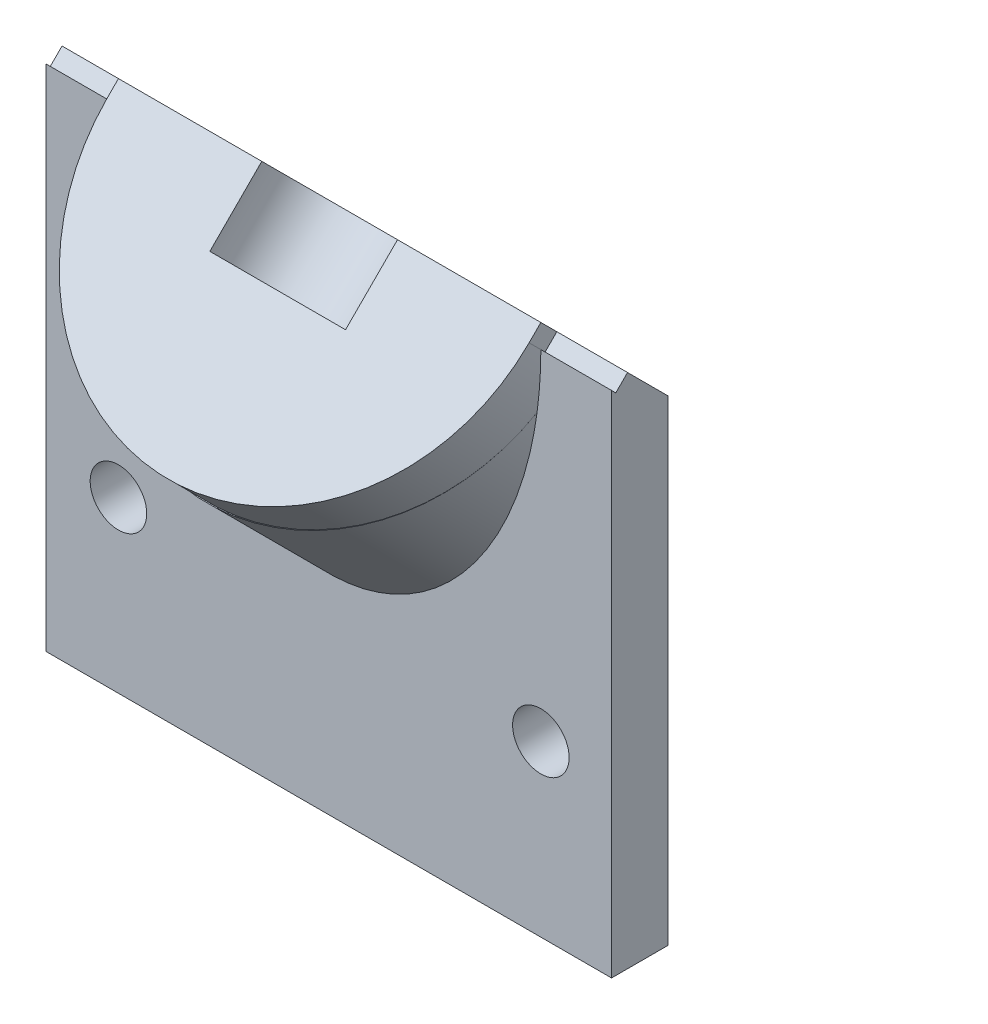
ISO-10303-21;
HEADER;
FILE_DESCRIPTION(('STEP AP214'),'2;1');
FILE_NAME('part.step','',(''),(''),'','','');
FILE_SCHEMA(('AUTOMOTIVE_DESIGN { 1 0 10303 214 1 1 1 1 }'));
ENDSEC;
DATA;
#1=APPLICATION_CONTEXT('core data for automotive mechanical design processes');
#2=APPLICATION_PROTOCOL_DEFINITION('international standard','automotive_design',2000,#1);
#3=PRODUCT_CONTEXT('',#1,'mechanical');
#4=PRODUCT('Part','Part','',(#3));
#5=PRODUCT_RELATED_PRODUCT_CATEGORY('part','',(#4));
#6=PRODUCT_DEFINITION_FORMATION('','',#4);
#7=PRODUCT_DEFINITION_CONTEXT('part definition',#1,'design');
#8=PRODUCT_DEFINITION('design','',#6,#7);
#9=PRODUCT_DEFINITION_SHAPE('','',#8);
#10=(LENGTH_UNIT() NAMED_UNIT(*) SI_UNIT(.MILLI.,.METRE.));
#11=(NAMED_UNIT(*) PLANE_ANGLE_UNIT() SI_UNIT($,.RADIAN.));
#12=(NAMED_UNIT(*) SI_UNIT($,.STERADIAN.) SOLID_ANGLE_UNIT());
#13=UNCERTAINTY_MEASURE_WITH_UNIT(LENGTH_MEASURE(1.E-05),#10,'distance_accuracy_value','');
#14=(GEOMETRIC_REPRESENTATION_CONTEXT(3) GLOBAL_UNCERTAINTY_ASSIGNED_CONTEXT((#13)) GLOBAL_UNIT_ASSIGNED_CONTEXT((#10,
#11,#12)) REPRESENTATION_CONTEXT('',''));
#15=CARTESIAN_POINT('',(0.,0.,0.));
#16=DIRECTION('',(0.,0.,1.));
#17=DIRECTION('',(1.,0.,0.));
#18=AXIS2_PLACEMENT_3D('',#15,#16,#17);
#19=CARTESIAN_POINT('',(25.,17.5,5.));
#20=DIRECTION('',(-1.,0.,0.));
#21=DIRECTION('',(0.,-1.,0.));
#22=AXIS2_PLACEMENT_3D('',#19,#20,#21);
#23=PLANE('',#22);
#24=DIRECTION('',(0.,0.707106781186547,-0.707106781186547));
#25=VECTOR('',#24,1.);
#26=CARTESIAN_POINT('',(25.,22.1173960312763,4.62524465584301));
#27=LINE('',#26,#25);
#28=CARTESIAN_POINT('',(25.,22.1173960312763,4.62524465584301));
#29=VERTEX_POINT('',#28);
#30=CARTESIAN_POINT('',(25.,23.1568542494924,3.5857864376269));
#31=VERTEX_POINT('',#30);
#32=EDGE_CURVE('E187',#29,#31,#27,.T.);
#33=ORIENTED_EDGE('',*,*,#32,.F.);
#34=DIRECTION('',(0.,0.707106781186548,0.707106781186547));
#35=VECTOR('',#34,1.);
#36=CARTESIAN_POINT('',(25.,22.1173960312763,4.62524465584301));
#37=LINE('',#36,#35);
#38=CARTESIAN_POINT('',(25.,22.4921513754333,5.));
#39=VERTEX_POINT('',#38);
#40=EDGE_CURVE('E199',#29,#39,#37,.T.);
#41=ORIENTED_EDGE('',*,*,#40,.T.);
#42=DIRECTION('',(0.,1.,0.));
#43=VECTOR('',#42,1.);
#44=CARTESIAN_POINT('',(25.,17.5,5.));
#45=LINE('',#44,#43);
#46=CARTESIAN_POINT('',(25.,-22.5,5.));
#47=VERTEX_POINT('',#46);
#48=EDGE_CURVE('E268',#47,#39,#45,.T.);
#49=ORIENTED_EDGE('',*,*,#48,.F.);
#50=DIRECTION('',(0.,0.,-1.));
#51=VECTOR('',#50,1.);
#52=CARTESIAN_POINT('',(25.,-22.5,0.));
#53=LINE('',#52,#51);
#54=CARTESIAN_POINT('',(25.,-22.5,0.));
#55=VERTEX_POINT('',#54);
#56=EDGE_CURVE('E248',#47,#55,#53,.T.);
#57=ORIENTED_EDGE('',*,*,#56,.T.);
#58=DIRECTION('',(0.,1.,0.));
#59=VECTOR('',#58,1.);
#60=CARTESIAN_POINT('',(25.,17.5,0.));
#61=LINE('',#60,#59);
#62=CARTESIAN_POINT('',(25.,19.5710678118655,0.));
#63=VERTEX_POINT('',#62);
#64=EDGE_CURVE('E264',#55,#63,#61,.T.);
#65=ORIENTED_EDGE('',*,*,#64,.T.);
#66=DIRECTION('',(0.,0.707106781186548,0.707106781186547));
#67=VECTOR('',#66,1.);
#68=CARTESIAN_POINT('',(25.,9.78553390593274,-9.78553390593274));
#69=LINE('',#68,#67);
#70=EDGE_CURVE('E221',#63,#31,#69,.T.);
#71=ORIENTED_EDGE('',*,*,#70,.T.);
#72=EDGE_LOOP('',(#33,#41,#49,#57,#65,#71));
#73=FACE_BOUND('',#72,.T.);
#74=ADVANCED_FACE('F48',(#73),#23,.F.);
#75=CARTESIAN_POINT('',(-25.,17.5,5.));
#76=DIRECTION('',(1.,0.,0.));
#77=DIRECTION('',(0.,1.,0.));
#78=AXIS2_PLACEMENT_3D('',#75,#76,#77);
#79=PLANE('',#78);
#80=DIRECTION('',(0.,-1.,0.));
#81=VECTOR('',#80,1.);
#82=CARTESIAN_POINT('',(-25.,17.5,5.));
#83=LINE('',#82,#81);
#84=CARTESIAN_POINT('',(-25.,22.4921513754333,5.));
#85=VERTEX_POINT('',#84);
#86=CARTESIAN_POINT('',(-25.,-22.5,5.));
#87=VERTEX_POINT('',#86);
#88=EDGE_CURVE('E263',#85,#87,#83,.T.);
#89=ORIENTED_EDGE('',*,*,#88,.F.);
#90=DIRECTION('',(0.,0.707106781186548,0.707106781186547));
#91=VECTOR('',#90,1.);
#92=CARTESIAN_POINT('',(-25.,22.1173960312763,4.625244655843));
#93=LINE('',#92,#91);
#94=CARTESIAN_POINT('',(-25.,22.1173960312763,4.625244655843));
#95=VERTEX_POINT('',#94);
#96=EDGE_CURVE('E204',#95,#85,#93,.T.);
#97=ORIENTED_EDGE('',*,*,#96,.F.);
#98=DIRECTION('',(0.,-0.707106781186548,0.707106781186547));
#99=VECTOR('',#98,1.);
#100=CARTESIAN_POINT('',(-25.,22.1173960312763,4.625244655843));
#101=LINE('',#100,#99);
#102=CARTESIAN_POINT('',(-25.,23.1568542494924,3.5857864376269));
#103=VERTEX_POINT('',#102);
#104=EDGE_CURVE('E209',#103,#95,#101,.T.);
#105=ORIENTED_EDGE('',*,*,#104,.F.);
#106=DIRECTION('',(0.,0.707106781186548,0.707106781186547));
#107=VECTOR('',#106,1.);
#108=CARTESIAN_POINT('',(-25.,9.78553390593274,-9.78553390593274));
#109=LINE('',#108,#107);
#110=CARTESIAN_POINT('',(-25.,19.5710678118655,0.));
#111=VERTEX_POINT('',#110);
#112=EDGE_CURVE('E225',#111,#103,#109,.T.);
#113=ORIENTED_EDGE('',*,*,#112,.F.);
#114=DIRECTION('',(0.,-1.,0.));
#115=VECTOR('',#114,1.);
#116=CARTESIAN_POINT('',(-25.,17.5,0.));
#117=LINE('',#116,#115);
#118=CARTESIAN_POINT('',(-25.,-22.5,0.));
#119=VERTEX_POINT('',#118);
#120=EDGE_CURVE('E261',#111,#119,#117,.T.);
#121=ORIENTED_EDGE('',*,*,#120,.T.);
#122=DIRECTION('',(0.,0.,-1.));
#123=VECTOR('',#122,1.);
#124=CARTESIAN_POINT('',(-25.,-22.5,0.));
#125=LINE('',#124,#123);
#126=EDGE_CURVE('E249',#87,#119,#125,.T.);
#127=ORIENTED_EDGE('',*,*,#126,.F.);
#128=EDGE_LOOP('',(#89,#97,#105,#113,#121,#127));
#129=FACE_BOUND('',#128,.T.);
#130=ADVANCED_FACE('F314',(#129),#79,.F.);
#131=CARTESIAN_POINT('',(0.,0.,0.));
#132=DIRECTION('',(0.,0.,1.));
#133=DIRECTION('',(1.,0.,0.));
#134=AXIS2_PLACEMENT_3D('',#131,#132,#133);
#135=PLANE('',#134);
#136=CARTESIAN_POINT('',(-18.5967425130746,-7.5,0.));
#137=DIRECTION('',(0.,0.,1.));
#138=DIRECTION('',(1.,0.,0.));
#139=AXIS2_PLACEMENT_3D('',#136,#137,#138);
#140=CIRCLE('',#139,2.5);
#141=CARTESIAN_POINT('',(-16.0967425130746,-7.5,0.));
#142=VERTEX_POINT('',#141);
#143=EDGE_CURVE('E336',#142,#142,#140,.T.);
#144=ORIENTED_EDGE('',*,*,#143,.T.);
#145=EDGE_LOOP('',(#144));
#146=FACE_BOUND('',#145,.T.);
#147=CARTESIAN_POINT('',(18.7497984900395,-7.5,0.));
#148=DIRECTION('',(0.,0.,1.));
#149=DIRECTION('',(1.,0.,0.));
#150=AXIS2_PLACEMENT_3D('',#147,#148,#149);
#151=CIRCLE('',#150,2.5);
#152=CARTESIAN_POINT('',(21.2497984900394,-7.5,0.));
#153=VERTEX_POINT('',#152);
#154=EDGE_CURVE('E338',#153,#153,#151,.T.);
#155=ORIENTED_EDGE('',*,*,#154,.T.);
#156=EDGE_LOOP('',(#155));
#157=FACE_BOUND('',#156,.T.);
#158=DIRECTION('',(1.,0.,0.));
#159=VECTOR('',#158,1.);
#160=CARTESIAN_POINT('',(-25.,19.5710678118655,0.));
#161=LINE('',#160,#159);
#162=EDGE_CURVE('E228',#111,#63,#161,.T.);
#163=ORIENTED_EDGE('',*,*,#162,.T.);
#164=ORIENTED_EDGE('',*,*,#64,.F.);
#165=DIRECTION('',(1.,0.,0.));
#166=VECTOR('',#165,1.);
#167=CARTESIAN_POINT('',(-25.,-22.5,0.));
#168=LINE('',#167,#166);
#169=EDGE_CURVE('E255',#119,#55,#168,.T.);
#170=ORIENTED_EDGE('',*,*,#169,.F.);
#171=ORIENTED_EDGE('',*,*,#120,.F.);
#172=EDGE_LOOP('',(#163,#164,#170,#171));
#173=FACE_BOUND('',#172,.T.);
#174=ADVANCED_FACE('F325',(#146,#157,#173),#135,.F.);
#175=CARTESIAN_POINT('',(0.,-15.3553390593274,-32.8553390593274));
#176=DIRECTION('',(0.,0.707106781186548,0.707106781186548));
#177=DIRECTION('',(0.,-0.707106781186548,0.707106781186548));
#178=AXIS2_PLACEMENT_3D('',#175,#176,#177);
#179=CYLINDRICAL_SURFACE('',#178,18.75);
#180=CARTESIAN_POINT('',(0.,20.,2.49999999999999));
#181=DIRECTION('',(0.,-0.707106781186548,-0.707106781186548));
#182=DIRECTION('',(0.,0.707106781186548,-0.707106781186548));
#183=AXIS2_PLACEMENT_3D('',#180,#181,#182);
#184=CIRCLE('',#183,18.75);
#185=CARTESIAN_POINT('',(-18.4136498283203,17.5,5.));
#186=VERTEX_POINT('',#185);
#187=CARTESIAN_POINT('',(18.4136498283203,17.5,5.));
#188=VERTEX_POINT('',#187);
#189=EDGE_CURVE('E271',#186,#188,#184,.F.);
#190=ORIENTED_EDGE('',*,*,#189,.F.);
#191=CARTESIAN_POINT('',(0.,22.5,5.));
#192=DIRECTION('',(0.,0.,1.));
#193=DIRECTION('',(0.,1.,0.));
#194=AXIS2_PLACEMENT_3D('',#191,#192,#193);
#195=ELLIPSE('',#194,26.5165042944955,18.75);
#196=EDGE_CURVE('E258',#186,#188,#195,.T.);
#197=ORIENTED_EDGE('',*,*,#196,.T.);
#198=EDGE_LOOP('',(#190,#197));
#199=FACE_BOUND('',#198,.T.);
#200=ADVANCED_FACE('F50',(#199),#179,.T.);
#201=CARTESIAN_POINT('',(0.,0.,5.));
#202=DIRECTION('',(0.,0.,1.));
#203=DIRECTION('',(1.,0.,0.));
#204=AXIS2_PLACEMENT_3D('',#201,#202,#203);
#205=PLANE('',#204);
#206=CARTESIAN_POINT('',(-18.5967425130746,-7.5,5.));
#207=DIRECTION('',(0.,0.,1.));
#208=DIRECTION('',(1.,0.,0.));
#209=AXIS2_PLACEMENT_3D('',#206,#207,#208);
#210=CIRCLE('',#209,2.5);
#211=CARTESIAN_POINT('',(-16.0967425130746,-7.5,5.));
#212=VERTEX_POINT('',#211);
#213=EDGE_CURVE('E343',#212,#212,#210,.T.);
#214=ORIENTED_EDGE('',*,*,#213,.F.);
#215=EDGE_LOOP('',(#214));
#216=FACE_BOUND('',#215,.T.);
#217=CARTESIAN_POINT('',(18.7497984900395,-7.5,5.));
#218=DIRECTION('',(0.,0.,1.));
#219=DIRECTION('',(1.,0.,0.));
#220=AXIS2_PLACEMENT_3D('',#217,#218,#219);
#221=CIRCLE('',#220,2.5);
#222=CARTESIAN_POINT('',(21.2497984900394,-7.5,5.));
#223=VERTEX_POINT('',#222);
#224=EDGE_CURVE('E344',#223,#223,#221,.T.);
#225=ORIENTED_EDGE('',*,*,#224,.F.);
#226=EDGE_LOOP('',(#225));
#227=FACE_BOUND('',#226,.T.);
#228=DIRECTION('',(1.,0.,0.));
#229=VECTOR('',#228,1.);
#230=CARTESIAN_POINT('',(-25.,22.4921513754333,5.));
#231=LINE('',#230,#229);
#232=CARTESIAN_POINT('',(-18.5967425130746,22.4921513754333,5.));
#233=VERTEX_POINT('',#232);
#234=EDGE_CURVE('E219',#85,#233,#231,.T.);
#235=ORIENTED_EDGE('',*,*,#234,.F.);
#236=ORIENTED_EDGE('',*,*,#88,.T.);
#237=DIRECTION('',(1.,0.,0.));
#238=VECTOR('',#237,1.);
#239=CARTESIAN_POINT('',(-25.,-22.5,5.));
#240=LINE('',#239,#238);
#241=EDGE_CURVE('E252',#87,#47,#240,.T.);
#242=ORIENTED_EDGE('',*,*,#241,.T.);
#243=ORIENTED_EDGE('',*,*,#48,.T.);
#244=CARTESIAN_POINT('',(18.7497984900394,22.4921513754333,5.));
#245=VERTEX_POINT('',#244);
#246=EDGE_CURVE('E223',#245,#39,#231,.T.);
#247=ORIENTED_EDGE('',*,*,#246,.F.);
#248=CARTESIAN_POINT('',(0.0766372130690672,22.4960756665423,5.));
#249=DIRECTION('',(0.,0.,1.));
#250=DIRECTION('',(0.,-1.,0.));
#251=AXIS2_PLACEMENT_3D('',#248,#249,#250);
#252=ELLIPSE('',#251,26.4078382218529,18.6731614831495);
#253=CARTESIAN_POINT('',(18.4125738878852,17.5,5.));
#254=VERTEX_POINT('',#253);
#255=EDGE_CURVE('E280',#254,#245,#252,.T.);
#256=ORIENTED_EDGE('',*,*,#255,.F.);
#257=DIRECTION('',(1.,0.,0.));
#258=VECTOR('',#257,1.);
#259=CARTESIAN_POINT('',(-25.,17.5,5.));
#260=LINE('',#259,#258);
#261=EDGE_CURVE('E275',#254,#188,#260,.T.);
#262=ORIENTED_EDGE('',*,*,#261,.T.);
#263=ORIENTED_EDGE('',*,*,#196,.F.);
#264=CARTESIAN_POINT('',(-18.2592994617471,17.5,5.));
#265=VERTEX_POINT('',#264);
#266=EDGE_CURVE('E276',#186,#265,#260,.T.);
#267=ORIENTED_EDGE('',*,*,#266,.T.);
#268=CARTESIAN_POINT('',(-18.5965240639013,22.4921513754333,5.));
#269=VERTEX_POINT('',#268);
#270=EDGE_CURVE('E278',#269,#265,#252,.T.);
#271=ORIENTED_EDGE('',*,*,#270,.F.);
#272=EDGE_CURVE('E222',#233,#269,#231,.T.);
#273=ORIENTED_EDGE('',*,*,#272,.F.);
#274=EDGE_LOOP('',(#235,#236,#242,#243,#247,#256,#262,#263,#267,#271,#273));
#275=FACE_BOUND('',#274,.T.);
#276=ADVANCED_FACE('F293',(#216,#227,#275),#205,.T.);
#277=CARTESIAN_POINT('',(-25.,22.5,0.));
#278=DIRECTION('',(0.,0.707106781186547,0.707106781186548));
#279=DIRECTION('',(0.,-0.707106781186548,0.707106781186547));
#280=AXIS2_PLACEMENT_3D('',#277,#278,#279);
#281=PLANE('',#280);
#282=ORIENTED_EDGE('',*,*,#261,.F.);
#283=CARTESIAN_POINT('',(0.0766372130690674,19.9980378332711,2.50196216672886));
#284=DIRECTION('',(0.,0.707106781186548,0.707106781186547));
#285=DIRECTION('',(0.,-0.707106781186547,0.707106781186548));
#286=AXIS2_PLACEMENT_3D('',#283,#284,#285);
#287=CIRCLE('',#286,18.6731614831495);
#288=EDGE_CURVE('E239',#265,#254,#287,.T.);
#289=ORIENTED_EDGE('',*,*,#288,.F.);
#290=ORIENTED_EDGE('',*,*,#266,.F.);
#291=ORIENTED_EDGE('',*,*,#189,.T.);
#292=EDGE_LOOP('',(#282,#289,#290,#291));
#293=FACE_BOUND('',#292,.T.);
#294=ADVANCED_FACE('F355',(#293),#281,.T.);
#295=CARTESIAN_POINT('',(-25.,-22.5,0.));
#296=DIRECTION('',(0.,-1.,0.));
#297=DIRECTION('',(1.,0.,0.));
#298=AXIS2_PLACEMENT_3D('',#295,#296,#297);
#299=PLANE('',#298);
#300=ORIENTED_EDGE('',*,*,#56,.F.);
#301=ORIENTED_EDGE('',*,*,#241,.F.);
#302=ORIENTED_EDGE('',*,*,#126,.T.);
#303=ORIENTED_EDGE('',*,*,#169,.T.);
#304=EDGE_LOOP('',(#300,#301,#302,#303));
#305=FACE_BOUND('',#304,.T.);
#306=ADVANCED_FACE('F322',(#305),#299,.T.);
#307=CARTESIAN_POINT('',(0.0766372130690671,23.5335717392039,6.0374960726616));
#308=DIRECTION('',(0.,-0.707106781186548,-0.707106781186548));
#309=DIRECTION('',(0.,0.707106781186548,-0.707106781186548));
#310=AXIS2_PLACEMENT_3D('',#307,#308,#309);
#311=CYLINDRICAL_SURFACE('',#310,18.6731614831495);
#312=ORIENTED_EDGE('',*,*,#255,.T.);
#313=DIRECTION('',(0.,-0.707106781186548,-0.707106781186548));
#314=VECTOR('',#313,1.);
#315=CARTESIAN_POINT('',(18.7497984900395,23.5316095936494,6.03945821821611));
#316=LINE('',#315,#314);
#317=CARTESIAN_POINT('',(18.7497984900395,23.5316095936494,6.03945821821611));
#318=VERTEX_POINT('',#317);
#319=EDGE_CURVE('E236',#245,#318,#316,.F.);
#320=ORIENTED_EDGE('',*,*,#319,.T.);
#321=CARTESIAN_POINT('',(0.0766372130690671,23.5335717392039,6.0374960726616));
#322=DIRECTION('',(0.,0.707106781186548,0.707106781186547));
#323=DIRECTION('',(0.,-0.707106781186547,0.707106781186548));
#324=AXIS2_PLACEMENT_3D('',#321,#322,#323);
#325=CIRCLE('',#324,18.6731614831495);
#326=CARTESIAN_POINT('',(-18.5965240639013,23.5316095936494,6.03945821821611));
#327=VERTEX_POINT('',#326);
#328=EDGE_CURVE('E240',#327,#318,#325,.T.);
#329=ORIENTED_EDGE('',*,*,#328,.F.);
#330=DIRECTION('',(0.,-0.707106781186548,-0.707106781186548));
#331=VECTOR('',#330,1.);
#332=CARTESIAN_POINT('',(-18.5965240639013,23.5316095936494,6.03945821821611));
#333=LINE('',#332,#331);
#334=EDGE_CURVE('E243',#327,#269,#333,.T.);
#335=ORIENTED_EDGE('',*,*,#334,.T.);
#336=ORIENTED_EDGE('',*,*,#270,.T.);
#337=ORIENTED_EDGE('',*,*,#288,.T.);
#338=EDGE_LOOP('',(#312,#320,#329,#335,#336,#337));
#339=FACE_BOUND('',#338,.T.);
#340=ADVANCED_FACE('F285',(#339),#311,.T.);
#341=CARTESIAN_POINT('',(0.,14.7855339059327,14.7855339059327));
#342=DIRECTION('',(0.,0.707106781186548,0.707106781186547));
#343=DIRECTION('',(0.,-0.707106781186547,0.707106781186548));
#344=AXIS2_PLACEMENT_3D('',#341,#342,#343);
#345=PLANE('',#344);
#346=DIRECTION('',(0.,0.707106781186548,-0.707106781186548));
#347=VECTOR('',#346,1.);
#348=CARTESIAN_POINT('',(6.07652798848241,19.9748737341529,9.59619407771256));
#349=LINE('',#348,#347);
#350=CARTESIAN_POINT('',(6.07652798848241,19.9748737341529,9.59619407771256));
#351=VERTEX_POINT('',#350);
#352=CARTESIAN_POINT('',(6.07652798848241,24.5710678118655,5.));
#353=VERTEX_POINT('',#352);
#354=EDGE_CURVE('E63',#351,#353,#349,.T.);
#355=ORIENTED_EDGE('',*,*,#354,.F.);
#356=DIRECTION('',(-1.,0.,0.));
#357=VECTOR('',#356,1.);
#358=CARTESIAN_POINT('',(0.,19.9748737341529,9.59619407771256));
#359=LINE('',#358,#357);
#360=CARTESIAN_POINT('',(-5.92347201151759,19.9748737341529,9.59619407771256));
#361=VERTEX_POINT('',#360);
#362=EDGE_CURVE('E13',#351,#361,#359,.T.);
#363=ORIENTED_EDGE('',*,*,#362,.T.);
#364=DIRECTION('',(0.,0.707106781186548,-0.707106781186548));
#365=VECTOR('',#364,1.);
#366=CARTESIAN_POINT('',(-5.92347201151759,19.9748737341529,9.59619407771256));
#367=LINE('',#366,#365);
#368=CARTESIAN_POINT('',(-5.92347201151759,24.5710678118655,5.));
#369=VERTEX_POINT('',#368);
#370=EDGE_CURVE('E166',#369,#361,#367,.F.);
#371=ORIENTED_EDGE('',*,*,#370,.F.);
#372=DIRECTION('',(1.,0.,0.));
#373=VECTOR('',#372,1.);
#374=CARTESIAN_POINT('',(-25.,24.5710678118655,5.));
#375=LINE('',#374,#373);
#376=CARTESIAN_POINT('',(-18.5967425130746,24.5710678118655,5.));
#377=VERTEX_POINT('',#376);
#378=EDGE_CURVE('E233',#377,#369,#375,.T.);
#379=ORIENTED_EDGE('',*,*,#378,.F.);
#380=DIRECTION('',(0.,0.707106781186548,-0.707106781186547));
#381=VECTOR('',#380,1.);
#382=CARTESIAN_POINT('',(-18.5967425130746,23.5316095936494,6.0394582182161));
#383=LINE('',#382,#381);
#384=CARTESIAN_POINT('',(-18.5967425130746,23.5316095936494,6.0394582182161));
#385=VERTEX_POINT('',#384);
#386=EDGE_CURVE('E194',#385,#377,#383,.T.);
#387=ORIENTED_EDGE('',*,*,#386,.F.);
#388=DIRECTION('',(1.,0.,0.));
#389=VECTOR('',#388,1.);
#390=CARTESIAN_POINT('',(-25.,23.5316095936494,6.03945821821611));
#391=LINE('',#390,#389);
#392=EDGE_CURVE('E198',#385,#327,#391,.T.);
#393=ORIENTED_EDGE('',*,*,#392,.T.);
#394=ORIENTED_EDGE('',*,*,#328,.T.);
#395=DIRECTION('',(0.,-0.707106781186547,0.707106781186547));
#396=VECTOR('',#395,1.);
#397=CARTESIAN_POINT('',(18.7497984900394,23.5316095936494,6.0394582182161));
#398=LINE('',#397,#396);
#399=CARTESIAN_POINT('',(18.7497984900394,24.5710678118655,5.));
#400=VERTEX_POINT('',#399);
#401=EDGE_CURVE('E184',#400,#318,#398,.T.);
#402=ORIENTED_EDGE('',*,*,#401,.F.);
#403=EDGE_CURVE('E172',#353,#400,#375,.T.);
#404=ORIENTED_EDGE('',*,*,#403,.F.);
#405=EDGE_LOOP('',(#355,#363,#371,#379,#387,#393,#394,#402,#404));
#406=FACE_BOUND('',#405,.T.);
#407=ADVANCED_FACE('F170',(#406),#345,.T.);
#408=CARTESIAN_POINT('',(-25.,9.78553390593274,-9.78553390593274));
#409=DIRECTION('',(0.,0.707106781186547,-0.707106781186548));
#410=DIRECTION('',(0.,0.707106781186548,0.707106781186547));
#411=AXIS2_PLACEMENT_3D('',#408,#409,#410);
#412=PLANE('',#411);
#413=CARTESIAN_POINT('',(0.0765279884824094,24.5710678118655,5.));
#414=DIRECTION('',(0.,0.707106781186548,-0.707106781186548));
#415=DIRECTION('',(0.,0.707106781186548,0.707106781186548));
#416=AXIS2_PLACEMENT_3D('',#413,#414,#415);
#417=CIRCLE('',#416,6.);
#418=EDGE_CURVE('E167',#353,#369,#417,.T.);
#419=ORIENTED_EDGE('',*,*,#418,.F.);
#420=ORIENTED_EDGE('',*,*,#403,.T.);
#421=DIRECTION('',(0.,0.707106781186548,0.707106781186547));
#422=VECTOR('',#421,1.);
#423=CARTESIAN_POINT('',(18.7497984900394,23.1568542494924,3.5857864376269));
#424=LINE('',#423,#422);
#425=CARTESIAN_POINT('',(18.7497984900394,23.1568542494924,3.5857864376269));
#426=VERTEX_POINT('',#425);
#427=EDGE_CURVE('E195',#426,#400,#424,.T.);
#428=ORIENTED_EDGE('',*,*,#427,.F.);
#429=DIRECTION('',(-1.,0.,0.));
#430=VECTOR('',#429,1.);
#431=CARTESIAN_POINT('',(18.7497984900394,23.1568542494924,3.5857864376269));
#432=LINE('',#431,#430);
#433=EDGE_CURVE('E189',#31,#426,#432,.T.);
#434=ORIENTED_EDGE('',*,*,#433,.F.);
#435=ORIENTED_EDGE('',*,*,#70,.F.);
#436=ORIENTED_EDGE('',*,*,#162,.F.);
#437=ORIENTED_EDGE('',*,*,#112,.T.);
#438=DIRECTION('',(-1.,0.,0.));
#439=VECTOR('',#438,1.);
#440=CARTESIAN_POINT('',(-25.,23.1568542494924,3.5857864376269));
#441=LINE('',#440,#439);
#442=CARTESIAN_POINT('',(-18.5967425130746,23.1568542494924,3.5857864376269));
#443=VERTEX_POINT('',#442);
#444=EDGE_CURVE('E206',#443,#103,#441,.T.);
#445=ORIENTED_EDGE('',*,*,#444,.F.);
#446=DIRECTION('',(0.,0.707106781186548,0.707106781186547));
#447=VECTOR('',#446,1.);
#448=CARTESIAN_POINT('',(-18.5967425130746,23.1568542494924,3.5857864376269));
#449=LINE('',#448,#447);
#450=EDGE_CURVE('E173',#443,#377,#449,.T.);
#451=ORIENTED_EDGE('',*,*,#450,.T.);
#452=ORIENTED_EDGE('',*,*,#378,.T.);
#453=EDGE_LOOP('',(#419,#420,#428,#434,#435,#436,#437,#445,#451,#452));
#454=FACE_BOUND('',#453,.T.);
#455=ADVANCED_FACE('F306',(#454),#412,.T.);
#456=CARTESIAN_POINT('',(-25.,22.4921513754333,5.));
#457=DIRECTION('',(0.,-0.707106781186547,0.707106781186548));
#458=DIRECTION('',(0.,-0.707106781186548,-0.707106781186547));
#459=AXIS2_PLACEMENT_3D('',#456,#457,#458);
#460=PLANE('',#459);
#461=DIRECTION('',(0.,0.707106781186548,0.707106781186547));
#462=VECTOR('',#461,1.);
#463=CARTESIAN_POINT('',(-18.5967425130746,22.4921513754333,5.));
#464=LINE('',#463,#462);
#465=EDGE_CURVE('E56',#233,#385,#464,.T.);
#466=ORIENTED_EDGE('',*,*,#465,.F.);
#467=ORIENTED_EDGE('',*,*,#272,.T.);
#468=ORIENTED_EDGE('',*,*,#334,.F.);
#469=ORIENTED_EDGE('',*,*,#392,.F.);
#470=EDGE_LOOP('',(#466,#467,#468,#469));
#471=FACE_BOUND('',#470,.T.);
#472=ADVANCED_FACE('F300',(#471),#460,.T.);
#473=CARTESIAN_POINT('',(18.7497984900394,22.1173960312763,4.62524465584301));
#474=DIRECTION('',(-1.,0.,0.));
#475=DIRECTION('',(0.,0.,1.));
#476=AXIS2_PLACEMENT_3D('',#473,#474,#475);
#477=PLANE('',#476);
#478=ORIENTED_EDGE('',*,*,#401,.T.);
#479=ORIENTED_EDGE('',*,*,#319,.F.);
#480=DIRECTION('',(0.,0.707106781186548,0.707106781186547));
#481=VECTOR('',#480,1.);
#482=CARTESIAN_POINT('',(18.7497984900394,22.1173960312763,4.62524465584301));
#483=LINE('',#482,#481);
#484=CARTESIAN_POINT('',(18.7497984900394,22.1173960312763,4.62524465584301));
#485=VERTEX_POINT('',#484);
#486=EDGE_CURVE('E192',#485,#245,#483,.T.);
#487=ORIENTED_EDGE('',*,*,#486,.F.);
#488=DIRECTION('',(0.,-0.707106781186547,0.707106781186547));
#489=VECTOR('',#488,1.);
#490=CARTESIAN_POINT('',(18.7497984900394,22.1173960312763,4.62524465584301));
#491=LINE('',#490,#489);
#492=EDGE_CURVE('E180',#426,#485,#491,.T.);
#493=ORIENTED_EDGE('',*,*,#492,.F.);
#494=ORIENTED_EDGE('',*,*,#427,.T.);
#495=EDGE_LOOP('',(#478,#479,#487,#493,#494));
#496=FACE_BOUND('',#495,.T.);
#497=ADVANCED_FACE('F335',(#496),#477,.F.);
#498=CARTESIAN_POINT('',(18.7497984900394,22.1173960312763,4.62524465584301));
#499=DIRECTION('',(0.,-0.707106781186548,0.707106781186548));
#500=DIRECTION('',(0.,-0.707106781186548,-0.707106781186547));
#501=AXIS2_PLACEMENT_3D('',#498,#499,#500);
#502=PLANE('',#501);
#503=ORIENTED_EDGE('',*,*,#246,.T.);
#504=ORIENTED_EDGE('',*,*,#40,.F.);
#505=DIRECTION('',(1.,0.,0.));
#506=VECTOR('',#505,1.);
#507=CARTESIAN_POINT('',(18.7497984900394,22.1173960312763,4.62524465584301));
#508=LINE('',#507,#506);
#509=EDGE_CURVE('E183',#485,#29,#508,.T.);
#510=ORIENTED_EDGE('',*,*,#509,.F.);
#511=ORIENTED_EDGE('',*,*,#486,.T.);
#512=EDGE_LOOP('',(#503,#504,#510,#511));
#513=FACE_BOUND('',#512,.T.);
#514=ADVANCED_FACE('F329',(#513),#502,.F.);
#515=CARTESIAN_POINT('',(0.,13.3713203435596,13.3713203435596));
#516=DIRECTION('',(0.,-0.707106781186547,-0.707106781186547));
#517=DIRECTION('',(0.,0.707106781186548,-0.707106781186548));
#518=AXIS2_PLACEMENT_3D('',#515,#516,#517);
#519=PLANE('',#518);
#520=ORIENTED_EDGE('',*,*,#492,.T.);
#521=ORIENTED_EDGE('',*,*,#509,.T.);
#522=ORIENTED_EDGE('',*,*,#32,.T.);
#523=ORIENTED_EDGE('',*,*,#433,.T.);
#524=EDGE_LOOP('',(#520,#521,#522,#523));
#525=FACE_BOUND('',#524,.T.);
#526=ADVANCED_FACE('F331',(#525),#519,.F.);
#527=CARTESIAN_POINT('',(-18.5967425130746,22.1173960312763,4.625244655843));
#528=DIRECTION('',(1.,0.,0.));
#529=DIRECTION('',(0.,0.,-1.));
#530=AXIS2_PLACEMENT_3D('',#527,#528,#529);
#531=PLANE('',#530);
#532=ORIENTED_EDGE('',*,*,#386,.T.);
#533=ORIENTED_EDGE('',*,*,#450,.F.);
#534=DIRECTION('',(0.,0.707106781186548,-0.707106781186547));
#535=VECTOR('',#534,1.);
#536=CARTESIAN_POINT('',(-18.5967425130746,22.1173960312763,4.625244655843));
#537=LINE('',#536,#535);
#538=CARTESIAN_POINT('',(-18.5967425130746,22.1173960312763,4.625244655843));
#539=VERTEX_POINT('',#538);
#540=EDGE_CURVE('E211',#539,#443,#537,.T.);
#541=ORIENTED_EDGE('',*,*,#540,.F.);
#542=DIRECTION('',(0.,0.707106781186548,0.707106781186547));
#543=VECTOR('',#542,1.);
#544=CARTESIAN_POINT('',(-18.5967425130746,22.1173960312763,4.625244655843));
#545=LINE('',#544,#543);
#546=EDGE_CURVE('E71',#539,#233,#545,.T.);
#547=ORIENTED_EDGE('',*,*,#546,.T.);
#548=ORIENTED_EDGE('',*,*,#465,.T.);
#549=EDGE_LOOP('',(#532,#533,#541,#547,#548));
#550=FACE_BOUND('',#549,.T.);
#551=ADVANCED_FACE('F303',(#550),#531,.F.);
#552=CARTESIAN_POINT('',(-25.,22.1173960312763,4.625244655843));
#553=DIRECTION('',(0.,-0.707106781186547,0.707106781186548));
#554=DIRECTION('',(0.,-0.707106781186548,-0.707106781186547));
#555=AXIS2_PLACEMENT_3D('',#552,#553,#554);
#556=PLANE('',#555);
#557=ORIENTED_EDGE('',*,*,#234,.T.);
#558=ORIENTED_EDGE('',*,*,#546,.F.);
#559=DIRECTION('',(1.,0.,0.));
#560=VECTOR('',#559,1.);
#561=CARTESIAN_POINT('',(-25.,22.1173960312763,4.625244655843));
#562=LINE('',#561,#560);
#563=EDGE_CURVE('E214',#95,#539,#562,.T.);
#564=ORIENTED_EDGE('',*,*,#563,.F.);
#565=ORIENTED_EDGE('',*,*,#96,.T.);
#566=EDGE_LOOP('',(#557,#558,#564,#565));
#567=FACE_BOUND('',#566,.T.);
#568=ADVANCED_FACE('F318',(#567),#556,.F.);
#569=CARTESIAN_POINT('',(0.,13.3713203435596,13.3713203435596));
#570=DIRECTION('',(0.,-0.707106781186547,-0.707106781186548));
#571=DIRECTION('',(0.,0.707106781186548,-0.707106781186547));
#572=AXIS2_PLACEMENT_3D('',#569,#570,#571);
#573=PLANE('',#572);
#574=ORIENTED_EDGE('',*,*,#104,.T.);
#575=ORIENTED_EDGE('',*,*,#563,.T.);
#576=ORIENTED_EDGE('',*,*,#540,.T.);
#577=ORIENTED_EDGE('',*,*,#444,.T.);
#578=EDGE_LOOP('',(#574,#575,#576,#577));
#579=FACE_BOUND('',#578,.T.);
#580=ADVANCED_FACE('F310',(#579),#573,.F.);
#581=CARTESIAN_POINT('',(0.0765279884824098,19.9748737341529,9.59619407771256));
#582=DIRECTION('',(0.,0.707106781186548,-0.707106781186548));
#583=DIRECTION('',(0.,0.707106781186548,0.707106781186548));
#584=AXIS2_PLACEMENT_3D('',#581,#582,#583);
#585=CYLINDRICAL_SURFACE('',#584,6.);
#586=ORIENTED_EDGE('',*,*,#354,.T.);
#587=ORIENTED_EDGE('',*,*,#418,.T.);
#588=ORIENTED_EDGE('',*,*,#370,.T.);
#589=CARTESIAN_POINT('',(0.0765279884824098,19.9748737341529,9.59619407771256));
#590=DIRECTION('',(0.,0.707106781186548,-0.707106781186548));
#591=DIRECTION('',(0.,0.707106781186548,0.707106781186548));
#592=AXIS2_PLACEMENT_3D('',#589,#590,#591);
#593=CIRCLE('',#592,6.);
#594=EDGE_CURVE('E162',#351,#361,#593,.T.);
#595=ORIENTED_EDGE('',*,*,#594,.F.);
#596=EDGE_LOOP('',(#586,#587,#588,#595));
#597=FACE_BOUND('',#596,.T.);
#598=ADVANCED_FACE('F165',(#597),#585,.F.);
#599=CARTESIAN_POINT('',(0.0765279884824098,19.9748737341529,9.59619407771256));
#600=DIRECTION('',(0.,0.707106781186548,-0.707106781186548));
#601=DIRECTION('',(0.,0.707106781186548,0.707106781186548));
#602=AXIS2_PLACEMENT_3D('',#599,#600,#601);
#603=PLANE('',#602);
#604=ORIENTED_EDGE('',*,*,#594,.T.);
#605=ORIENTED_EDGE('',*,*,#362,.F.);
#606=EDGE_LOOP('',(#604,#605));
#607=FACE_BOUND('',#606,.T.);
#608=ADVANCED_FACE('F161',(#607),#603,.T.);
#609=CARTESIAN_POINT('',(18.7497984900395,-7.5,-1.5));
#610=DIRECTION('',(0.,0.,1.));
#611=DIRECTION('',(1.,0.,0.));
#612=AXIS2_PLACEMENT_3D('',#609,#610,#611);
#613=CYLINDRICAL_SURFACE('',#612,2.5);
#614=CARTESIAN_POINT('',(21.2497984900394,-7.5,5.));
#615=CARTESIAN_POINT('',(21.2497984900394,-7.5,4.94791666666667));
#616=CARTESIAN_POINT('',(21.2497984900394,-7.5,4.89583333333333));
#617=CARTESIAN_POINT('',(21.2497984900394,-7.5,4.79166666666667));
#618=CARTESIAN_POINT('',(21.2497984900394,-7.5,4.73958333333333));
#619=CARTESIAN_POINT('',(21.2497984900394,-7.5,4.63541666666667));
#620=CARTESIAN_POINT('',(21.2497984900394,-7.5,4.58333333333333));
#621=CARTESIAN_POINT('',(21.2497984900394,-7.5,4.47916666666667));
#622=CARTESIAN_POINT('',(21.2497984900394,-7.5,4.42708333333333));
#623=CARTESIAN_POINT('',(21.2497984900394,-7.5,4.32291666666667));
#624=CARTESIAN_POINT('',(21.2497984900394,-7.5,4.27083333333333));
#625=CARTESIAN_POINT('',(21.2497984900394,-7.5,4.16666666666667));
#626=CARTESIAN_POINT('',(21.2497984900394,-7.5,4.11458333333333));
#627=CARTESIAN_POINT('',(21.2497984900394,-7.5,4.01041666666667));
#628=CARTESIAN_POINT('',(21.2497984900394,-7.5,3.95833333333333));
#629=CARTESIAN_POINT('',(21.2497984900394,-7.5,3.85416666666667));
#630=CARTESIAN_POINT('',(21.2497984900394,-7.5,3.80208333333333));
#631=CARTESIAN_POINT('',(21.2497984900394,-7.5,3.69791666666667));
#632=CARTESIAN_POINT('',(21.2497984900394,-7.5,3.64583333333333));
#633=CARTESIAN_POINT('',(21.2497984900394,-7.5,3.54166666666667));
#634=CARTESIAN_POINT('',(21.2497984900394,-7.5,3.48958333333333));
#635=CARTESIAN_POINT('',(21.2497984900394,-7.5,3.38541666666667));
#636=CARTESIAN_POINT('',(21.2497984900394,-7.5,3.33333333333333));
#637=CARTESIAN_POINT('',(21.2497984900394,-7.5,3.22916666666667));
#638=CARTESIAN_POINT('',(21.2497984900394,-7.5,3.17708333333333));
#639=CARTESIAN_POINT('',(21.2497984900394,-7.5,3.07291666666667));
#640=CARTESIAN_POINT('',(21.2497984900394,-7.5,3.02083333333333));
#641=CARTESIAN_POINT('',(21.2497984900394,-7.5,2.91666666666667));
#642=CARTESIAN_POINT('',(21.2497984900394,-7.5,2.86458333333333));
#643=CARTESIAN_POINT('',(21.2497984900394,-7.5,2.76041666666667));
#644=CARTESIAN_POINT('',(21.2497984900394,-7.5,2.70833333333333));
#645=CARTESIAN_POINT('',(21.2497984900394,-7.5,2.60416666666667));
#646=CARTESIAN_POINT('',(21.2497984900394,-7.5,2.55208333333333));
#647=CARTESIAN_POINT('',(21.2497984900394,-7.5,2.44791666666667));
#648=CARTESIAN_POINT('',(21.2497984900394,-7.5,2.39583333333333));
#649=CARTESIAN_POINT('',(21.2497984900394,-7.5,2.29166666666667));
#650=CARTESIAN_POINT('',(21.2497984900394,-7.5,2.23958333333333));
#651=CARTESIAN_POINT('',(21.2497984900394,-7.5,2.13541666666667));
#652=CARTESIAN_POINT('',(21.2497984900394,-7.5,2.08333333333333));
#653=CARTESIAN_POINT('',(21.2497984900394,-7.5,1.97916666666667));
#654=CARTESIAN_POINT('',(21.2497984900394,-7.5,1.92708333333333));
#655=CARTESIAN_POINT('',(21.2497984900394,-7.5,1.82291666666667));
#656=CARTESIAN_POINT('',(21.2497984900394,-7.5,1.77083333333333));
#657=CARTESIAN_POINT('',(21.2497984900394,-7.5,1.66666666666667));
#658=CARTESIAN_POINT('',(21.2497984900394,-7.5,1.61458333333333));
#659=CARTESIAN_POINT('',(21.2497984900394,-7.5,1.51041666666667));
#660=CARTESIAN_POINT('',(21.2497984900394,-7.5,1.45833333333333));
#661=CARTESIAN_POINT('',(21.2497984900394,-7.5,1.35416666666667));
#662=CARTESIAN_POINT('',(21.2497984900394,-7.5,1.30208333333333));
#663=CARTESIAN_POINT('',(21.2497984900394,-7.5,1.19791666666667));
#664=CARTESIAN_POINT('',(21.2497984900394,-7.5,1.14583333333333));
#665=CARTESIAN_POINT('',(21.2497984900394,-7.5,1.04166666666667));
#666=CARTESIAN_POINT('',(21.2497984900394,-7.5,0.989583333333333));
#667=CARTESIAN_POINT('',(21.2497984900394,-7.5,0.885416666666666));
#668=CARTESIAN_POINT('',(21.2497984900394,-7.5,0.833333333333333));
#669=CARTESIAN_POINT('',(21.2497984900394,-7.5,0.729166666666666));
#670=CARTESIAN_POINT('',(21.2497984900394,-7.5,0.677083333333333));
#671=CARTESIAN_POINT('',(21.2497984900394,-7.5,0.572916666666667));
#672=CARTESIAN_POINT('',(21.2497984900394,-7.5,0.520833333333333));
#673=CARTESIAN_POINT('',(21.2497984900394,-7.5,0.416666666666667));
#674=CARTESIAN_POINT('',(21.2497984900394,-7.5,0.364583333333333));
#675=CARTESIAN_POINT('',(21.2497984900394,-7.5,0.260416666666667));
#676=CARTESIAN_POINT('',(21.2497984900394,-7.5,0.208333333333333));
#677=CARTESIAN_POINT('',(21.2497984900394,-7.5,0.104166666666667));
#678=CARTESIAN_POINT('',(21.2497984900394,-7.5,0.0520833333333332));
#679=CARTESIAN_POINT('',(21.2497984900394,-7.5,0.));
#680=B_SPLINE_CURVE_WITH_KNOTS('',3,(#614,#615,#616,#617,#618,#619,#620,#621,#622,#623,#624,
#625,#626,#627,#628,#629,#630,#631,#632,#633,#634,#635,#636,#637,#638,#639,#640,#641,#642,#643,
#644,#645,#646,#647,#648,#649,#650,#651,#652,#653,#654,#655,#656,#657,#658,#659,#660,#661,#662,
#663,#664,#665,#666,#667,#668,#669,#670,#671,#672,#673,#674,#675,#676,#677,#678,#679),
.UNSPECIFIED.,.F.,.F.,(4,2,2,2,2,2,2,2,2,2,2,2,2,2,2,2,2,2,2,2,2,2,2,2,2,2,2,2,2,2,2,2,4),(0.,
0.15625,0.3125,0.46875,0.625000000000001,0.78125,0.9375,1.09375,1.25,1.40625,1.5625,1.71875,
1.875,2.03125,2.1875,2.34375,2.5,2.65625,2.8125,2.96875,3.125,3.28125,3.4375,3.59375,3.75,
3.90625,4.0625,4.21875,4.375,4.53125,4.6875,4.84375,5.),.UNSPECIFIED.);
#681=EDGE_CURVE('BSEAM359',#223,#153,#680,.T.);
#682=ORIENTED_EDGE('',*,*,#224,.T.);
#683=ORIENTED_EDGE('',*,*,#154,.F.);
#684=ORIENTED_EDGE('',*,*,#681,.T.);
#685=ORIENTED_EDGE('',*,*,#681,.F.);
#686=EDGE_LOOP('',(#682,#684,#683,#685));
#687=FACE_BOUND('',#686,.T.);
#688=ADVANCED_FACE('F359',(#687),#613,.F.);
#689=CARTESIAN_POINT('',(-18.5967425130746,-7.5,-1.5));
#690=DIRECTION('',(0.,0.,1.));
#691=DIRECTION('',(1.,0.,0.));
#692=AXIS2_PLACEMENT_3D('',#689,#690,#691);
#693=CYLINDRICAL_SURFACE('',#692,2.5);
#694=CARTESIAN_POINT('',(-16.0967425130746,-7.5,5.));
#695=CARTESIAN_POINT('',(-16.0967425130746,-7.5,4.94791666666667));
#696=CARTESIAN_POINT('',(-16.0967425130746,-7.5,4.89583333333333));
#697=CARTESIAN_POINT('',(-16.0967425130746,-7.5,4.79166666666667));
#698=CARTESIAN_POINT('',(-16.0967425130746,-7.5,4.73958333333333));
#699=CARTESIAN_POINT('',(-16.0967425130746,-7.5,4.63541666666667));
#700=CARTESIAN_POINT('',(-16.0967425130746,-7.5,4.58333333333333));
#701=CARTESIAN_POINT('',(-16.0967425130746,-7.5,4.47916666666667));
#702=CARTESIAN_POINT('',(-16.0967425130746,-7.5,4.42708333333333));
#703=CARTESIAN_POINT('',(-16.0967425130746,-7.5,4.32291666666667));
#704=CARTESIAN_POINT('',(-16.0967425130746,-7.5,4.27083333333333));
#705=CARTESIAN_POINT('',(-16.0967425130746,-7.5,4.16666666666667));
#706=CARTESIAN_POINT('',(-16.0967425130746,-7.5,4.11458333333333));
#707=CARTESIAN_POINT('',(-16.0967425130746,-7.5,4.01041666666667));
#708=CARTESIAN_POINT('',(-16.0967425130746,-7.5,3.95833333333333));
#709=CARTESIAN_POINT('',(-16.0967425130746,-7.5,3.85416666666667));
#710=CARTESIAN_POINT('',(-16.0967425130746,-7.5,3.80208333333333));
#711=CARTESIAN_POINT('',(-16.0967425130746,-7.5,3.69791666666667));
#712=CARTESIAN_POINT('',(-16.0967425130746,-7.5,3.64583333333333));
#713=CARTESIAN_POINT('',(-16.0967425130746,-7.5,3.54166666666667));
#714=CARTESIAN_POINT('',(-16.0967425130746,-7.5,3.48958333333333));
#715=CARTESIAN_POINT('',(-16.0967425130746,-7.5,3.38541666666667));
#716=CARTESIAN_POINT('',(-16.0967425130746,-7.5,3.33333333333333));
#717=CARTESIAN_POINT('',(-16.0967425130746,-7.5,3.22916666666667));
#718=CARTESIAN_POINT('',(-16.0967425130746,-7.5,3.17708333333333));
#719=CARTESIAN_POINT('',(-16.0967425130746,-7.5,3.07291666666667));
#720=CARTESIAN_POINT('',(-16.0967425130746,-7.5,3.02083333333333));
#721=CARTESIAN_POINT('',(-16.0967425130746,-7.5,2.91666666666667));
#722=CARTESIAN_POINT('',(-16.0967425130746,-7.5,2.86458333333333));
#723=CARTESIAN_POINT('',(-16.0967425130746,-7.5,2.76041666666667));
#724=CARTESIAN_POINT('',(-16.0967425130746,-7.5,2.70833333333333));
#725=CARTESIAN_POINT('',(-16.0967425130746,-7.5,2.60416666666667));
#726=CARTESIAN_POINT('',(-16.0967425130746,-7.5,2.55208333333333));
#727=CARTESIAN_POINT('',(-16.0967425130746,-7.5,2.44791666666667));
#728=CARTESIAN_POINT('',(-16.0967425130746,-7.5,2.39583333333333));
#729=CARTESIAN_POINT('',(-16.0967425130746,-7.5,2.29166666666667));
#730=CARTESIAN_POINT('',(-16.0967425130746,-7.5,2.23958333333333));
#731=CARTESIAN_POINT('',(-16.0967425130746,-7.5,2.13541666666667));
#732=CARTESIAN_POINT('',(-16.0967425130746,-7.5,2.08333333333333));
#733=CARTESIAN_POINT('',(-16.0967425130746,-7.5,1.97916666666667));
#734=CARTESIAN_POINT('',(-16.0967425130746,-7.5,1.92708333333333));
#735=CARTESIAN_POINT('',(-16.0967425130746,-7.5,1.82291666666667));
#736=CARTESIAN_POINT('',(-16.0967425130746,-7.5,1.77083333333333));
#737=CARTESIAN_POINT('',(-16.0967425130746,-7.5,1.66666666666667));
#738=CARTESIAN_POINT('',(-16.0967425130746,-7.5,1.61458333333333));
#739=CARTESIAN_POINT('',(-16.0967425130746,-7.5,1.51041666666667));
#740=CARTESIAN_POINT('',(-16.0967425130746,-7.5,1.45833333333333));
#741=CARTESIAN_POINT('',(-16.0967425130746,-7.5,1.35416666666667));
#742=CARTESIAN_POINT('',(-16.0967425130746,-7.5,1.30208333333333));
#743=CARTESIAN_POINT('',(-16.0967425130746,-7.5,1.19791666666667));
#744=CARTESIAN_POINT('',(-16.0967425130746,-7.5,1.14583333333333));
#745=CARTESIAN_POINT('',(-16.0967425130746,-7.5,1.04166666666667));
#746=CARTESIAN_POINT('',(-16.0967425130746,-7.5,0.989583333333333));
#747=CARTESIAN_POINT('',(-16.0967425130746,-7.5,0.885416666666666));
#748=CARTESIAN_POINT('',(-16.0967425130746,-7.5,0.833333333333333));
#749=CARTESIAN_POINT('',(-16.0967425130746,-7.5,0.729166666666666));
#750=CARTESIAN_POINT('',(-16.0967425130746,-7.5,0.677083333333333));
#751=CARTESIAN_POINT('',(-16.0967425130746,-7.5,0.572916666666667));
#752=CARTESIAN_POINT('',(-16.0967425130746,-7.5,0.520833333333333));
#753=CARTESIAN_POINT('',(-16.0967425130746,-7.5,0.416666666666667));
#754=CARTESIAN_POINT('',(-16.0967425130746,-7.5,0.364583333333333));
#755=CARTESIAN_POINT('',(-16.0967425130746,-7.5,0.260416666666667));
#756=CARTESIAN_POINT('',(-16.0967425130746,-7.5,0.208333333333333));
#757=CARTESIAN_POINT('',(-16.0967425130746,-7.5,0.104166666666667));
#758=CARTESIAN_POINT('',(-16.0967425130746,-7.5,0.0520833333333332));
#759=CARTESIAN_POINT('',(-16.0967425130746,-7.5,0.));
#760=B_SPLINE_CURVE_WITH_KNOTS('',3,(#694,#695,#696,#697,#698,#699,#700,#701,#702,#703,#704,
#705,#706,#707,#708,#709,#710,#711,#712,#713,#714,#715,#716,#717,#718,#719,#720,#721,#722,#723,
#724,#725,#726,#727,#728,#729,#730,#731,#732,#733,#734,#735,#736,#737,#738,#739,#740,#741,#742,
#743,#744,#745,#746,#747,#748,#749,#750,#751,#752,#753,#754,#755,#756,#757,#758,#759),
.UNSPECIFIED.,.F.,.F.,(4,2,2,2,2,2,2,2,2,2,2,2,2,2,2,2,2,2,2,2,2,2,2,2,2,2,2,2,2,2,2,2,4),(0.,
0.15625,0.3125,0.46875,0.625000000000001,0.78125,0.9375,1.09375,1.25,1.40625,1.5625,1.71875,
1.875,2.03125,2.1875,2.34375,2.5,2.65625,2.8125,2.96875,3.125,3.28125,3.4375,3.59375,3.75,
3.90625,4.0625,4.21875,4.375,4.53125,4.6875,4.84375,5.),.UNSPECIFIED.);
#761=EDGE_CURVE('BSEAM350',#212,#142,#760,.T.);
#762=ORIENTED_EDGE('',*,*,#213,.T.);
#763=ORIENTED_EDGE('',*,*,#143,.F.);
#764=ORIENTED_EDGE('',*,*,#761,.T.);
#765=ORIENTED_EDGE('',*,*,#761,.F.);
#766=EDGE_LOOP('',(#762,#764,#763,#765));
#767=FACE_BOUND('',#766,.T.);
#768=ADVANCED_FACE('F350',(#767),#693,.F.);
#769=CLOSED_SHELL('',(#74,#130,#174,#200,#276,#294,#306,#340,#407,#455,#472,#497,#514,#526,#551,
#568,#580,#598,#608,#688,#768));
#770=MANIFOLD_SOLID_BREP('B2',#769);
#771=CARTESIAN_POINT('',(0.,-15.3553390593274,-32.8553390593274));
#772=DIRECTION('',(0.,0.707106781186548,0.707106781186548));
#773=DIRECTION('',(0.,-0.707106781186548,0.707106781186548));
#774=AXIS2_PLACEMENT_3D('',#771,#772,#773);
#775=PLANE('',#774);
#776=CARTESIAN_POINT('',(0.,-15.3553390593274,-32.8553390593274));
#777=DIRECTION('',(0.,0.707106781186548,0.707106781186548));
#778=DIRECTION('',(0.,-0.707106781186548,0.707106781186548));
#779=AXIS2_PLACEMENT_3D('',#776,#777,#778);
#780=CIRCLE('',#779,18.75);
#781=CARTESIAN_POINT('',(18.502677449962,-17.5016646616847,-30.7090134569702));
#782=VERTEX_POINT('',#781);
#783=CARTESIAN_POINT('',(18.5030635003803,-17.5,-30.7106781186548));
#784=VERTEX_POINT('',#783);
#785=EDGE_CURVE('E663',#782,#784,#780,.T.);
#786=ORIENTED_EDGE('',*,*,#785,.F.);
#787=DIRECTION('',(0.0290023617697623,0.706809331790327,-0.706809331790327));
#788=VECTOR('',#787,1.);
#789=CARTESIAN_POINT('',(18.5751098213488,-15.736433387544,-32.4742447311107));
#790=LINE('',#789,#788);
#791=CARTESIAN_POINT('',(18.5027457556821,-17.5,-30.7106781186548));
#792=VERTEX_POINT('',#791);
#793=EDGE_CURVE('E670',#782,#792,#790,.T.);
#794=ORIENTED_EDGE('',*,*,#793,.T.);
#795=DIRECTION('',(-1.,0.,0.));
#796=VECTOR('',#795,1.);
#797=CARTESIAN_POINT('',(0.,-17.5,-30.7106781186548));
#798=LINE('',#797,#796);
#799=EDGE_CURVE('E650',#784,#792,#798,.T.);
#800=ORIENTED_EDGE('',*,*,#799,.F.);
#801=EDGE_LOOP('',(#786,#794,#800));
#802=FACE_BOUND('',#801,.T.);
#803=ADVANCED_FACE('F642',(#802),#775,.F.);
#804=CARTESIAN_POINT('',(0.,-15.3553390593274,-32.8553390593274));
#805=DIRECTION('',(0.,0.707106781186548,0.707106781186548));
#806=DIRECTION('',(0.,-0.707106781186548,0.707106781186548));
#807=AXIS2_PLACEMENT_3D('',#804,#805,#806);
#808=CYLINDRICAL_SURFACE('',#807,18.75);
#809=CARTESIAN_POINT('',(0.,437.715128120166,420.215128120166));
#810=DIRECTION('',(0.999159216470123,0.,0.0409982943890376));
#811=DIRECTION('',(-0.0289779770616587,0.707404105511208,0.706215058145394));
#812=AXIS2_PLACEMENT_3D('',#809,#810,#811);
#813=ELLIPSE('',#812,646.770913025733,18.75);
#814=CARTESIAN_POINT('',(18.5025717642743,-17.5,-30.706437817411));
#815=VERTEX_POINT('',#814);
#816=EDGE_CURVE('E656',#782,#815,#813,.F.);
#817=ORIENTED_EDGE('',*,*,#816,.F.);
#818=ORIENTED_EDGE('',*,*,#785,.T.);
#819=CARTESIAN_POINT('',(0.,-17.5,-35.));
#820=DIRECTION('',(0.,1.,0.));
#821=DIRECTION('',(0.,0.,1.));
#822=AXIS2_PLACEMENT_3D('',#819,#820,#821);
#823=ELLIPSE('',#822,26.5165042944955,18.75);
#824=EDGE_CURVE('E675',#784,#815,#823,.F.);
#825=ORIENTED_EDGE('',*,*,#824,.T.);
#826=EDGE_LOOP('',(#817,#818,#825));
#827=FACE_BOUND('',#826,.T.);
#828=ADVANCED_FACE('F644',(#827),#808,.T.);
#829=CARTESIAN_POINT('',(25.,-17.5,-100.));
#830=DIRECTION('',(0.,1.,0.));
#831=DIRECTION('',(0.,0.,1.));
#832=AXIS2_PLACEMENT_3D('',#829,#830,#831);
#833=PLANE('',#832);
#834=DIRECTION('',(0.0409982943890376,0.,-0.999159216470123));
#835=VECTOR('',#834,1.);
#836=CARTESIAN_POINT('',(21.3520222971056,-17.5,-100.149686717915));
#837=LINE('',#836,#835);
#838=EDGE_CURVE('E46',#815,#792,#837,.T.);
#839=ORIENTED_EDGE('',*,*,#838,.F.);
#840=ORIENTED_EDGE('',*,*,#824,.F.);
#841=ORIENTED_EDGE('',*,*,#799,.T.);
#842=EDGE_LOOP('',(#839,#840,#841));
#843=FACE_BOUND('',#842,.T.);
#844=ADVANCED_FACE('F677',(#843),#833,.T.);
#845=CARTESIAN_POINT('',(17.5528289888744,-117.5,-7.56049329805893));
#846=DIRECTION('',(0.999159216470123,0.,0.0409982943890376));
#847=DIRECTION('',(0.0409982943890376,0.,-0.999159216470123));
#848=AXIS2_PLACEMENT_3D('',#845,#846,#847);
#849=PLANE('',#848);
#850=ORIENTED_EDGE('',*,*,#816,.T.);
#851=ORIENTED_EDGE('',*,*,#838,.T.);
#852=ORIENTED_EDGE('',*,*,#793,.F.);
#853=EDGE_LOOP('',(#850,#851,#852));
#854=FACE_BOUND('',#853,.T.);
#855=ADVANCED_FACE('F669',(#854),#849,.F.);
#856=CLOSED_SHELL('',(#803,#828,#844,#855));
#857=MANIFOLD_SOLID_BREP('B7',#856);
#858=ADVANCED_BREP_SHAPE_REPRESENTATION('',(#18,#770,#857),#14);
#859=SHAPE_DEFINITION_REPRESENTATION(#9,#858);
ENDSEC;
END-ISO-10303-21;
